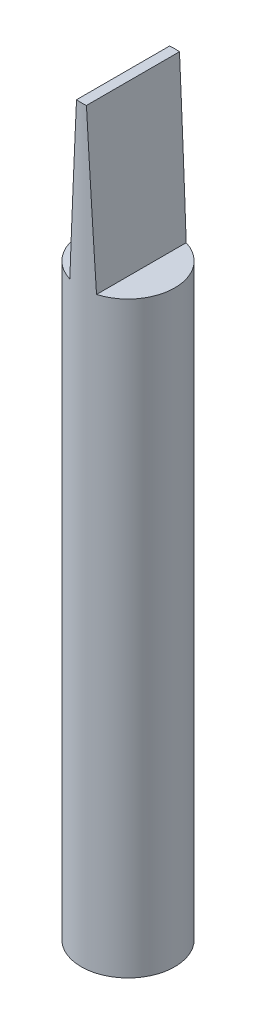
ISO-10303-21;
HEADER;
FILE_DESCRIPTION(('STEP AP214'),'2;1');
FILE_NAME('part.step','',(''),(''),'','','');
FILE_SCHEMA(('AUTOMOTIVE_DESIGN { 1 0 10303 214 1 1 1 1 }'));
ENDSEC;
DATA;
#1=APPLICATION_CONTEXT('core data for automotive mechanical design processes');
#2=APPLICATION_PROTOCOL_DEFINITION('international standard','automotive_design',2000,#1);
#3=PRODUCT_CONTEXT('',#1,'mechanical');
#4=PRODUCT('Part','Part','',(#3));
#5=PRODUCT_RELATED_PRODUCT_CATEGORY('part','',(#4));
#6=PRODUCT_DEFINITION_FORMATION('','',#4);
#7=PRODUCT_DEFINITION_CONTEXT('part definition',#1,'design');
#8=PRODUCT_DEFINITION('design','',#6,#7);
#9=PRODUCT_DEFINITION_SHAPE('','',#8);
#10=(LENGTH_UNIT() NAMED_UNIT(*) SI_UNIT(.MILLI.,.METRE.));
#11=(NAMED_UNIT(*) PLANE_ANGLE_UNIT() SI_UNIT($,.RADIAN.));
#12=(NAMED_UNIT(*) SI_UNIT($,.STERADIAN.) SOLID_ANGLE_UNIT());
#13=UNCERTAINTY_MEASURE_WITH_UNIT(LENGTH_MEASURE(1.E-05),#10,'distance_accuracy_value','');
#14=(GEOMETRIC_REPRESENTATION_CONTEXT(3) GLOBAL_UNCERTAINTY_ASSIGNED_CONTEXT((#13)) GLOBAL_UNIT_ASSIGNED_CONTEXT((#10,
#11,#12)) REPRESENTATION_CONTEXT('',''));
#15=CARTESIAN_POINT('',(0.,0.,0.));
#16=DIRECTION('',(0.,0.,1.));
#17=DIRECTION('',(1.,0.,0.));
#18=AXIS2_PLACEMENT_3D('',#15,#16,#17);
#19=CARTESIAN_POINT('',(0.,28.,0.));
#20=DIRECTION('',(0.,-1.,0.));
#21=DIRECTION('',(0.,0.,-1.));
#22=AXIS2_PLACEMENT_3D('',#19,#20,#21);
#23=CYLINDRICAL_SURFACE('',#22,1.75);
#24=CARTESIAN_POINT('',(0.,22.,0.));
#25=DIRECTION('',(0.,1.,0.));
#26=DIRECTION('',(0.,0.,1.));
#27=AXIS2_PLACEMENT_3D('',#24,#25,#26);
#28=CIRCLE('',#27,1.75);
#29=CARTESIAN_POINT('',(-0.5,22.,-1.67705098312484));
#30=VERTEX_POINT('',#29);
#31=CARTESIAN_POINT('',(-0.5,22.,1.67705098312484));
#32=VERTEX_POINT('',#31);
#33=EDGE_CURVE('E75',#30,#32,#28,.T.);
#34=ORIENTED_EDGE('',*,*,#33,.F.);
#35=CARTESIAN_POINT('',(0.,31.5405683438634,0.));
#36=DIRECTION('',(0.998629534754574,-0.0523359562429479,0.));
#37=DIRECTION('',(-0.0523359562429479,-0.998629534754574,0.));
#38=AXIS2_PLACEMENT_3D('',#35,#36,#37);
#39=ELLIPSE('',#38,33.4378145662678,1.75);
#40=CARTESIAN_POINT('',(-0.185553324301728,28.,-1.74013504184031));
#41=VERTEX_POINT('',#40);
#42=EDGE_CURVE('E48',#30,#41,#39,.T.);
#43=ORIENTED_EDGE('',*,*,#42,.T.);
#44=CARTESIAN_POINT('',(0.,28.,0.));
#45=DIRECTION('',(0.,1.,0.));
#46=DIRECTION('',(0.,0.,1.));
#47=AXIS2_PLACEMENT_3D('',#44,#45,#46);
#48=CIRCLE('',#47,1.75);
#49=CARTESIAN_POINT('',(0.185553324301774,28.,-1.7401350418403));
#50=VERTEX_POINT('',#49);
#51=EDGE_CURVE('E11',#50,#41,#48,.T.);
#52=ORIENTED_EDGE('',*,*,#51,.F.);
#53=CARTESIAN_POINT('',(0.,31.5405683438648,0.));
#54=DIRECTION('',(-0.998629534754574,-0.0523359562429403,0.));
#55=DIRECTION('',(0.0523359562429403,-0.998629534754574,0.));
#56=AXIS2_PLACEMENT_3D('',#53,#54,#55);
#57=ELLIPSE('',#56,33.4378145662727,1.75);
#58=CARTESIAN_POINT('',(0.5,22.,-1.67705098312484));
#59=VERTEX_POINT('',#58);
#60=EDGE_CURVE('E91',#50,#59,#57,.T.);
#61=ORIENTED_EDGE('',*,*,#60,.T.);
#62=CARTESIAN_POINT('',(0.,22.,0.));
#63=DIRECTION('',(0.,1.,0.));
#64=DIRECTION('',(0.,0.,-1.));
#65=AXIS2_PLACEMENT_3D('',#62,#63,#64);
#66=CIRCLE('',#65,1.75);
#67=CARTESIAN_POINT('',(0.5,22.,1.67705098312484));
#68=VERTEX_POINT('',#67);
#69=EDGE_CURVE('E88',#68,#59,#66,.T.);
#70=ORIENTED_EDGE('',*,*,#69,.F.);
#71=CARTESIAN_POINT('',(0.185553324301774,28.,1.74013504184031));
#72=VERTEX_POINT('',#71);
#73=EDGE_CURVE('E94',#68,#72,#57,.T.);
#74=ORIENTED_EDGE('',*,*,#73,.T.);
#75=CARTESIAN_POINT('',(-0.185553324301728,28.,1.74013504184031));
#76=VERTEX_POINT('',#75);
#77=EDGE_CURVE('E42',#76,#72,#48,.T.);
#78=ORIENTED_EDGE('',*,*,#77,.F.);
#79=EDGE_CURVE('E70',#76,#32,#39,.T.);
#80=ORIENTED_EDGE('',*,*,#79,.T.);
#81=EDGE_LOOP('',(#34,#43,#52,#61,#70,#74,#78,#80));
#82=FACE_BOUND('',#81,.T.);
#83=CARTESIAN_POINT('',(0.,0.,0.));
#84=DIRECTION('',(0.,1.,0.));
#85=DIRECTION('',(0.,0.,1.));
#86=AXIS2_PLACEMENT_3D('',#83,#84,#85);
#87=CIRCLE('',#86,1.75);
#88=CARTESIAN_POINT('',(0.,0.,1.75));
#89=VERTEX_POINT('',#88);
#90=EDGE_CURVE('E36',#89,#89,#87,.T.);
#91=ORIENTED_EDGE('',*,*,#90,.T.);
#92=EDGE_LOOP('',(#91));
#93=FACE_BOUND('',#92,.T.);
#94=ADVANCED_FACE('F33',(#82,#93),#23,.T.);
#95=CARTESIAN_POINT('',(0.,28.,0.));
#96=DIRECTION('',(0.,1.,0.));
#97=DIRECTION('',(0.,0.,1.));
#98=AXIS2_PLACEMENT_3D('',#95,#96,#97);
#99=PLANE('',#98);
#100=DIRECTION('',(0.,0.,-1.));
#101=VECTOR('',#100,1.);
#102=CARTESIAN_POINT('',(-0.185553324301728,28.,1.75));
#103=LINE('',#102,#101);
#104=EDGE_CURVE('E82',#76,#41,#103,.T.);
#105=ORIENTED_EDGE('',*,*,#104,.F.);
#106=ORIENTED_EDGE('',*,*,#77,.T.);
#107=DIRECTION('',(0.,0.,-1.));
#108=VECTOR('',#107,1.);
#109=CARTESIAN_POINT('',(0.185553324301774,28.,1.75));
#110=LINE('',#109,#108);
#111=EDGE_CURVE('E100',#72,#50,#110,.T.);
#112=ORIENTED_EDGE('',*,*,#111,.T.);
#113=ORIENTED_EDGE('',*,*,#51,.T.);
#114=EDGE_LOOP('',(#105,#106,#112,#113));
#115=FACE_BOUND('',#114,.T.);
#116=ADVANCED_FACE('F104',(#115),#99,.T.);
#117=CARTESIAN_POINT('',(0.,0.,0.));
#118=DIRECTION('',(0.,1.,0.));
#119=DIRECTION('',(0.,0.,1.));
#120=AXIS2_PLACEMENT_3D('',#117,#118,#119);
#121=PLANE('',#120);
#122=ORIENTED_EDGE('',*,*,#90,.F.);
#123=EDGE_LOOP('',(#122));
#124=FACE_BOUND('',#123,.T.);
#125=ADVANCED_FACE('F109',(#124),#121,.F.);
#126=CARTESIAN_POINT('',(0.,22.,0.));
#127=DIRECTION('',(0.,-1.,0.));
#128=DIRECTION('',(0.,0.,-1.));
#129=AXIS2_PLACEMENT_3D('',#126,#127,#128);
#130=PLANE('',#129);
#131=ORIENTED_EDGE('',*,*,#69,.T.);
#132=DIRECTION('',(0.,0.,1.));
#133=VECTOR('',#132,1.);
#134=CARTESIAN_POINT('',(0.5,22.,-1.67705098312484));
#135=LINE('',#134,#133);
#136=EDGE_CURVE('E85',#59,#68,#135,.T.);
#137=ORIENTED_EDGE('',*,*,#136,.T.);
#138=EDGE_LOOP('',(#131,#137));
#139=FACE_BOUND('',#138,.T.);
#140=ADVANCED_FACE('F107',(#139),#130,.F.);
#141=CARTESIAN_POINT('',(0.,22.,0.));
#142=DIRECTION('',(0.,1.,0.));
#143=DIRECTION('',(0.,0.,1.));
#144=AXIS2_PLACEMENT_3D('',#141,#142,#143);
#145=PLANE('',#144);
#146=ORIENTED_EDGE('',*,*,#33,.T.);
#147=DIRECTION('',(0.,0.,-1.));
#148=VECTOR('',#147,1.);
#149=CARTESIAN_POINT('',(-0.5,22.,1.67705098312484));
#150=LINE('',#149,#148);
#151=EDGE_CURVE('E67',#32,#30,#150,.T.);
#152=ORIENTED_EDGE('',*,*,#151,.T.);
#153=EDGE_LOOP('',(#146,#152));
#154=FACE_BOUND('',#153,.T.);
#155=ADVANCED_FACE('F84',(#154),#145,.T.);
#156=CARTESIAN_POINT('',(-0.5,22.,1.75));
#157=DIRECTION('',(0.998629534754574,-0.0523359562429479,0.));
#158=DIRECTION('',(0.0523359562429479,0.998629534754574,0.));
#159=AXIS2_PLACEMENT_3D('',#156,#157,#158);
#160=PLANE('',#159);
#161=ORIENTED_EDGE('',*,*,#151,.F.);
#162=ORIENTED_EDGE('',*,*,#79,.F.);
#163=ORIENTED_EDGE('',*,*,#104,.T.);
#164=ORIENTED_EDGE('',*,*,#42,.F.);
#165=EDGE_LOOP('',(#161,#162,#163,#164));
#166=FACE_BOUND('',#165,.T.);
#167=ADVANCED_FACE('F69',(#166),#160,.F.);
#168=CARTESIAN_POINT('',(0.5,22.,1.75));
#169=DIRECTION('',(-0.998629534754574,-0.0523359562429403,0.));
#170=DIRECTION('',(0.0523359562429403,-0.998629534754574,0.));
#171=AXIS2_PLACEMENT_3D('',#168,#169,#170);
#172=PLANE('',#171);
#173=ORIENTED_EDGE('',*,*,#136,.F.);
#174=ORIENTED_EDGE('',*,*,#60,.F.);
#175=ORIENTED_EDGE('',*,*,#111,.F.);
#176=ORIENTED_EDGE('',*,*,#73,.F.);
#177=EDGE_LOOP('',(#173,#174,#175,#176));
#178=FACE_BOUND('',#177,.T.);
#179=ADVANCED_FACE('F106',(#178),#172,.F.);
#180=CLOSED_SHELL('',(#94,#116,#125,#140,#155,#167,#179));
#181=MANIFOLD_SOLID_BREP('B2',#180);
#182=ADVANCED_BREP_SHAPE_REPRESENTATION('',(#18,#181),#14);
#183=SHAPE_DEFINITION_REPRESENTATION(#9,#182);
ENDSEC;
END-ISO-10303-21;
